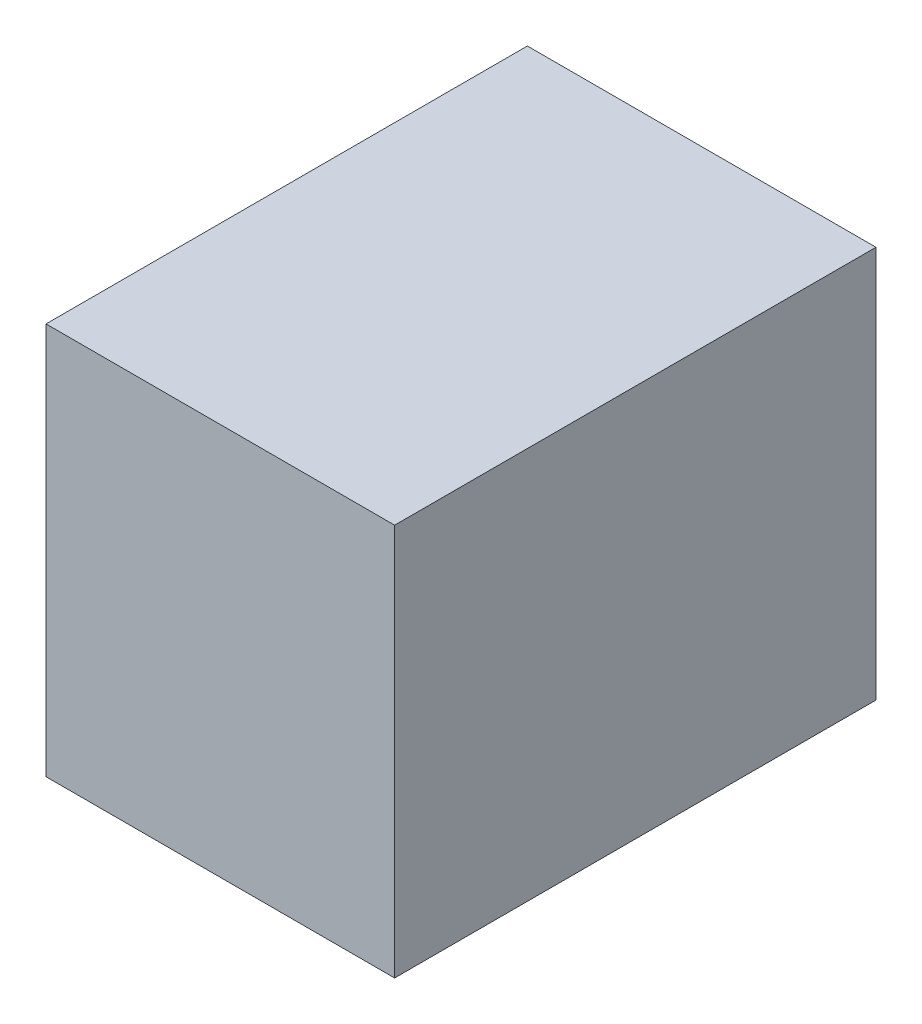
ISO-10303-21;
HEADER;
FILE_DESCRIPTION(('STEP AP214'),'2;1');
FILE_NAME('part.step','',(''),(''),'','','');
FILE_SCHEMA(('AUTOMOTIVE_DESIGN { 1 0 10303 214 1 1 1 1 }'));
ENDSEC;
DATA;
#1=APPLICATION_CONTEXT('core data for automotive mechanical design processes');
#2=APPLICATION_PROTOCOL_DEFINITION('international standard','automotive_design',2000,#1);
#3=PRODUCT_CONTEXT('',#1,'mechanical');
#4=PRODUCT('Part','Part','',(#3));
#5=PRODUCT_RELATED_PRODUCT_CATEGORY('part','',(#4));
#6=PRODUCT_DEFINITION_FORMATION('','',#4);
#7=PRODUCT_DEFINITION_CONTEXT('part definition',#1,'design');
#8=PRODUCT_DEFINITION('design','',#6,#7);
#9=PRODUCT_DEFINITION_SHAPE('','',#8);
#10=(LENGTH_UNIT() NAMED_UNIT(*) SI_UNIT(.MILLI.,.METRE.));
#11=(NAMED_UNIT(*) PLANE_ANGLE_UNIT() SI_UNIT($,.RADIAN.));
#12=(NAMED_UNIT(*) SI_UNIT($,.STERADIAN.) SOLID_ANGLE_UNIT());
#13=UNCERTAINTY_MEASURE_WITH_UNIT(LENGTH_MEASURE(1.E-05),#10,'distance_accuracy_value','');
#14=(GEOMETRIC_REPRESENTATION_CONTEXT(3) GLOBAL_UNCERTAINTY_ASSIGNED_CONTEXT((#13)) GLOBAL_UNIT_ASSIGNED_CONTEXT((#10,
#11,#12)) REPRESENTATION_CONTEXT('',''));
#15=CARTESIAN_POINT('',(0.,0.,0.));
#16=DIRECTION('',(0.,0.,1.));
#17=DIRECTION('',(1.,0.,0.));
#18=AXIS2_PLACEMENT_3D('',#15,#16,#17);
#19=CARTESIAN_POINT('',(-42.7781815141974,45.,594.045278836222));
#20=DIRECTION('',(0.,0.,-1.));
#21=DIRECTION('',(-1.,0.,0.));
#22=AXIS2_PLACEMENT_3D('',#19,#20,#21);
#23=PLANE('',#22);
#24=DIRECTION('',(0.,-1.,0.));
#25=VECTOR('',#24,1.);
#26=CARTESIAN_POINT('',(-82.7781815141974,45.,594.045278836222));
#27=LINE('',#26,#25);
#28=CARTESIAN_POINT('',(-82.7781815141974,45.,594.045278836222));
#29=VERTEX_POINT('',#28);
#30=CARTESIAN_POINT('',(-82.7781815141974,0.,594.045278836222));
#31=VERTEX_POINT('',#30);
#32=EDGE_CURVE('E112',#29,#31,#27,.T.);
#33=ORIENTED_EDGE('',*,*,#32,.T.);
#34=DIRECTION('',(-1.,0.,0.));
#35=VECTOR('',#34,1.);
#36=CARTESIAN_POINT('',(-42.7781815141974,0.,594.045278836222));
#37=LINE('',#36,#35);
#38=CARTESIAN_POINT('',(-42.7781815141974,0.,594.045278836222));
#39=VERTEX_POINT('',#38);
#40=EDGE_CURVE('E11',#39,#31,#37,.T.);
#41=ORIENTED_EDGE('',*,*,#40,.F.);
#42=DIRECTION('',(0.,-1.,0.));
#43=VECTOR('',#42,1.);
#44=CARTESIAN_POINT('',(-42.7781815141974,45.,594.045278836222));
#45=LINE('',#44,#43);
#46=CARTESIAN_POINT('',(-42.7781815141974,45.,594.045278836222));
#47=VERTEX_POINT('',#46);
#48=EDGE_CURVE('E113',#47,#39,#45,.T.);
#49=ORIENTED_EDGE('',*,*,#48,.F.);
#50=DIRECTION('',(-1.,0.,0.));
#51=VECTOR('',#50,1.);
#52=CARTESIAN_POINT('',(-42.7781815141974,45.,594.045278836222));
#53=LINE('',#52,#51);
#54=EDGE_CURVE('E119',#47,#29,#53,.T.);
#55=ORIENTED_EDGE('',*,*,#54,.T.);
#56=EDGE_LOOP('',(#33,#41,#49,#55));
#57=FACE_BOUND('',#56,.T.);
#58=ADVANCED_FACE('F37',(#57),#23,.F.);
#59=CARTESIAN_POINT('',(-42.7781815141974,0.,594.045278836222));
#60=DIRECTION('',(0.,1.,0.));
#61=DIRECTION('',(0.,0.,1.));
#62=AXIS2_PLACEMENT_3D('',#59,#60,#61);
#63=PLANE('',#62);
#64=DIRECTION('',(0.,0.,-1.));
#65=VECTOR('',#64,1.);
#66=CARTESIAN_POINT('',(-82.7781815141974,0.,594.045278836222));
#67=LINE('',#66,#65);
#68=CARTESIAN_POINT('',(-82.7781815141974,0.,538.812123597961));
#69=VERTEX_POINT('',#68);
#70=EDGE_CURVE('E122',#31,#69,#67,.T.);
#71=ORIENTED_EDGE('',*,*,#70,.T.);
#72=DIRECTION('',(-1.,0.,0.));
#73=VECTOR('',#72,1.);
#74=CARTESIAN_POINT('',(-42.7781815141974,0.,538.812123597961));
#75=LINE('',#74,#73);
#76=CARTESIAN_POINT('',(-42.7781815141974,0.,538.812123597961));
#77=VERTEX_POINT('',#76);
#78=EDGE_CURVE('E45',#77,#69,#75,.T.);
#79=ORIENTED_EDGE('',*,*,#78,.F.);
#80=DIRECTION('',(0.,0.,-1.));
#81=VECTOR('',#80,1.);
#82=CARTESIAN_POINT('',(-42.7781815141974,0.,594.045278836222));
#83=LINE('',#82,#81);
#84=EDGE_CURVE('E84',#39,#77,#83,.T.);
#85=ORIENTED_EDGE('',*,*,#84,.F.);
#86=ORIENTED_EDGE('',*,*,#40,.T.);
#87=EDGE_LOOP('',(#71,#79,#85,#86));
#88=FACE_BOUND('',#87,.T.);
#89=ADVANCED_FACE('F145',(#88),#63,.F.);
#90=CARTESIAN_POINT('',(-42.7781815141974,45.,538.812123597961));
#91=DIRECTION('',(0.,0.,1.));
#92=DIRECTION('',(1.,0.,0.));
#93=AXIS2_PLACEMENT_3D('',#90,#91,#92);
#94=PLANE('',#93);
#95=DIRECTION('',(0.,1.,0.));
#96=VECTOR('',#95,1.);
#97=CARTESIAN_POINT('',(-82.7781815141974,45.,538.812123597961));
#98=LINE('',#97,#96);
#99=CARTESIAN_POINT('',(-82.7781815141974,45.,538.812123597961));
#100=VERTEX_POINT('',#99);
#101=EDGE_CURVE('E71',#69,#100,#98,.T.);
#102=ORIENTED_EDGE('',*,*,#101,.T.);
#103=DIRECTION('',(-1.,0.,0.));
#104=VECTOR('',#103,1.);
#105=CARTESIAN_POINT('',(-42.7781815141974,45.,538.812123597961));
#106=LINE('',#105,#104);
#107=CARTESIAN_POINT('',(-42.7781815141974,45.,538.812123597961));
#108=VERTEX_POINT('',#107);
#109=EDGE_CURVE('E127',#108,#100,#106,.T.);
#110=ORIENTED_EDGE('',*,*,#109,.F.);
#111=DIRECTION('',(0.,1.,0.));
#112=VECTOR('',#111,1.);
#113=CARTESIAN_POINT('',(-42.7781815141974,45.,538.812123597961));
#114=LINE('',#113,#112);
#115=EDGE_CURVE('E116',#77,#108,#114,.T.);
#116=ORIENTED_EDGE('',*,*,#115,.F.);
#117=ORIENTED_EDGE('',*,*,#78,.T.);
#118=EDGE_LOOP('',(#102,#110,#116,#117));
#119=FACE_BOUND('',#118,.T.);
#120=ADVANCED_FACE('F129',(#119),#94,.F.);
#121=CARTESIAN_POINT('',(-42.7781815141974,45.,594.045278836222));
#122=DIRECTION('',(0.,-1.,0.));
#123=DIRECTION('',(0.,0.,-1.));
#124=AXIS2_PLACEMENT_3D('',#121,#122,#123);
#125=PLANE('',#124);
#126=DIRECTION('',(0.,0.,1.));
#127=VECTOR('',#126,1.);
#128=CARTESIAN_POINT('',(-82.7781815141974,45.,594.045278836222));
#129=LINE('',#128,#127);
#130=EDGE_CURVE('E77',#100,#29,#129,.T.);
#131=ORIENTED_EDGE('',*,*,#130,.T.);
#132=ORIENTED_EDGE('',*,*,#54,.F.);
#133=DIRECTION('',(0.,0.,1.));
#134=VECTOR('',#133,1.);
#135=CARTESIAN_POINT('',(-42.7781815141974,45.,594.045278836222));
#136=LINE('',#135,#134);
#137=EDGE_CURVE('E53',#108,#47,#136,.T.);
#138=ORIENTED_EDGE('',*,*,#137,.F.);
#139=ORIENTED_EDGE('',*,*,#109,.T.);
#140=EDGE_LOOP('',(#131,#132,#138,#139));
#141=FACE_BOUND('',#140,.T.);
#142=ADVANCED_FACE('F136',(#141),#125,.F.);
#143=CARTESIAN_POINT('',(-42.7781815141974,0.,0.));
#144=DIRECTION('',(1.,0.,0.));
#145=DIRECTION('',(0.,0.,-1.));
#146=AXIS2_PLACEMENT_3D('',#143,#144,#145);
#147=PLANE('',#146);
#148=ORIENTED_EDGE('',*,*,#48,.T.);
#149=ORIENTED_EDGE('',*,*,#84,.T.);
#150=ORIENTED_EDGE('',*,*,#115,.T.);
#151=ORIENTED_EDGE('',*,*,#137,.T.);
#152=EDGE_LOOP('',(#148,#149,#150,#151));
#153=FACE_BOUND('',#152,.T.);
#154=ADVANCED_FACE('F138',(#153),#147,.T.);
#155=CARTESIAN_POINT('',(-82.7781815141974,0.,0.));
#156=DIRECTION('',(1.,0.,0.));
#157=DIRECTION('',(0.,0.,-1.));
#158=AXIS2_PLACEMENT_3D('',#155,#156,#157);
#159=PLANE('',#158);
#160=CARTESIAN_POINT('',(-82.7781815141974,20.3151556563005,583.767961031319));
#161=DIRECTION('',(-1.,0.,0.));
#162=DIRECTION('',(0.,0.,1.));
#163=AXIS2_PLACEMENT_3D('',#160,#161,#162);
#164=CIRCLE('',#163,4.39999999999999);
#165=CARTESIAN_POINT('',(-82.7781815141974,20.3151556563005,588.167961031319));
#166=VERTEX_POINT('',#165);
#167=EDGE_CURVE('E102',#166,#166,#164,.T.);
#168=ORIENTED_EDGE('',*,*,#167,.F.);
#169=EDGE_LOOP('',(#168));
#170=FACE_BOUND('',#169,.T.);
#171=CARTESIAN_POINT('',(-82.7781815141974,20.3151556563005,558.767961031319));
#172=DIRECTION('',(-1.,0.,0.));
#173=DIRECTION('',(0.,0.,1.));
#174=AXIS2_PLACEMENT_3D('',#171,#172,#173);
#175=CIRCLE('',#174,4.39999999999999);
#176=CARTESIAN_POINT('',(-82.7781815141974,20.3151556563005,563.167961031319));
#177=VERTEX_POINT('',#176);
#178=EDGE_CURVE('E101',#177,#177,#175,.T.);
#179=ORIENTED_EDGE('',*,*,#178,.F.);
#180=EDGE_LOOP('',(#179));
#181=FACE_BOUND('',#180,.T.);
#182=ORIENTED_EDGE('',*,*,#32,.F.);
#183=ORIENTED_EDGE('',*,*,#130,.F.);
#184=ORIENTED_EDGE('',*,*,#101,.F.);
#185=ORIENTED_EDGE('',*,*,#70,.F.);
#186=EDGE_LOOP('',(#182,#183,#184,#185));
#187=FACE_BOUND('',#186,.T.);
#188=ADVANCED_FACE('F132',(#170,#181,#187),#159,.F.);
#189=CARTESIAN_POINT('',(-71.0281815141974,20.3151556563005,558.767961031319));
#190=DIRECTION('',(-1.,0.,0.));
#191=DIRECTION('',(0.,0.,1.));
#192=AXIS2_PLACEMENT_3D('',#189,#190,#191);
#193=CONICAL_SURFACE('',#192,4.39999999999999,1.02974425867665);
#194=CARTESIAN_POINT('',(-68.3843947904761,20.3151556563005,558.767961031319));
#195=VERTEX_POINT('',#194);
#196=VERTEX_LOOP('',#195);
#197=FACE_BOUND('',#196,.T.);
#198=CARTESIAN_POINT('',(-71.0281815141974,20.3151556563005,558.767961031319));
#199=DIRECTION('',(-1.,0.,0.));
#200=DIRECTION('',(0.,0.,1.));
#201=AXIS2_PLACEMENT_3D('',#198,#199,#200);
#202=CIRCLE('',#201,4.39999999999999);
#203=CARTESIAN_POINT('',(-71.0281815141974,20.3151556563005,563.167961031319));
#204=VERTEX_POINT('',#203);
#205=EDGE_CURVE('E105',#204,#204,#202,.T.);
#206=ORIENTED_EDGE('',*,*,#205,.T.);
#207=EDGE_LOOP('',(#206));
#208=FACE_BOUND('',#207,.T.);
#209=ADVANCED_FACE('F180',(#197,#208),#193,.F.);
#210=CARTESIAN_POINT('',(-82.7781815141974,20.3151556563005,558.767961031319));
#211=DIRECTION('',(-1.,0.,0.));
#212=DIRECTION('',(0.,0.,1.));
#213=AXIS2_PLACEMENT_3D('',#210,#211,#212);
#214=CYLINDRICAL_SURFACE('',#213,4.39999999999999);
#215=ORIENTED_EDGE('',*,*,#205,.F.);
#216=EDGE_LOOP('',(#215));
#217=FACE_BOUND('',#216,.T.);
#218=ORIENTED_EDGE('',*,*,#178,.T.);
#219=EDGE_LOOP('',(#218));
#220=FACE_BOUND('',#219,.T.);
#221=ADVANCED_FACE('F95',(#217,#220),#214,.F.);
#222=CARTESIAN_POINT('',(-71.0281815141974,20.3151556563005,583.767961031319));
#223=DIRECTION('',(-1.,0.,0.));
#224=DIRECTION('',(0.,0.,1.));
#225=AXIS2_PLACEMENT_3D('',#222,#223,#224);
#226=CONICAL_SURFACE('',#225,4.39999999999999,1.02974425867665);
#227=CARTESIAN_POINT('',(-68.3843947904761,20.3151556563005,583.767961031319));
#228=VERTEX_POINT('',#227);
#229=VERTEX_LOOP('',#228);
#230=FACE_BOUND('',#229,.T.);
#231=CARTESIAN_POINT('',(-71.0281815141974,20.3151556563005,583.767961031319));
#232=DIRECTION('',(-1.,0.,0.));
#233=DIRECTION('',(0.,0.,1.));
#234=AXIS2_PLACEMENT_3D('',#231,#232,#233);
#235=CIRCLE('',#234,4.39999999999999);
#236=CARTESIAN_POINT('',(-71.0281815141974,20.3151556563005,588.167961031319));
#237=VERTEX_POINT('',#236);
#238=EDGE_CURVE('E99',#237,#237,#235,.T.);
#239=ORIENTED_EDGE('',*,*,#238,.T.);
#240=EDGE_LOOP('',(#239));
#241=FACE_BOUND('',#240,.T.);
#242=ADVANCED_FACE('F91',(#230,#241),#226,.F.);
#243=CARTESIAN_POINT('',(-82.7781815141974,20.3151556563005,583.767961031319));
#244=DIRECTION('',(-1.,0.,0.));
#245=DIRECTION('',(0.,0.,1.));
#246=AXIS2_PLACEMENT_3D('',#243,#244,#245);
#247=CYLINDRICAL_SURFACE('',#246,4.39999999999999);
#248=ORIENTED_EDGE('',*,*,#238,.F.);
#249=EDGE_LOOP('',(#248));
#250=FACE_BOUND('',#249,.T.);
#251=ORIENTED_EDGE('',*,*,#167,.T.);
#252=EDGE_LOOP('',(#251));
#253=FACE_BOUND('',#252,.T.);
#254=ADVANCED_FACE('F94',(#250,#253),#247,.F.);
#255=CLOSED_SHELL('',(#58,#89,#120,#142,#154,#188,#209,#221,#242,#254));
#256=MANIFOLD_SOLID_BREP('B2',#255);
#257=ADVANCED_BREP_SHAPE_REPRESENTATION('',(#18,#256),#14);
#258=SHAPE_DEFINITION_REPRESENTATION(#9,#257);
ENDSEC;
END-ISO-10303-21;
